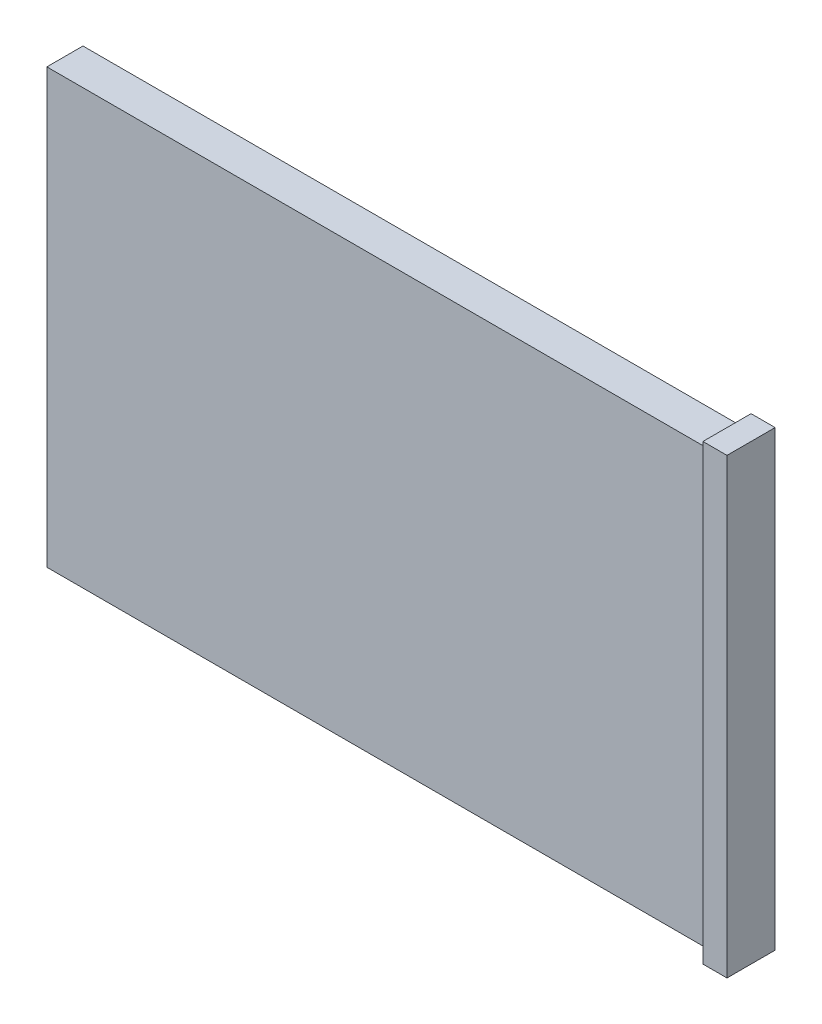
ISO-10303-21;
HEADER;
FILE_DESCRIPTION(('STEP AP214'),'2;1');
FILE_NAME('part.step','',(''),(''),'','','');
FILE_SCHEMA(('AUTOMOTIVE_DESIGN { 1 0 10303 214 1 1 1 1 }'));
ENDSEC;
DATA;
#1=APPLICATION_CONTEXT('core data for automotive mechanical design processes');
#2=APPLICATION_PROTOCOL_DEFINITION('international standard','automotive_design',2000,#1);
#3=PRODUCT_CONTEXT('',#1,'mechanical');
#4=PRODUCT('Part','Part','',(#3));
#5=PRODUCT_RELATED_PRODUCT_CATEGORY('part','',(#4));
#6=PRODUCT_DEFINITION_FORMATION('','',#4);
#7=PRODUCT_DEFINITION_CONTEXT('part definition',#1,'design');
#8=PRODUCT_DEFINITION('design','',#6,#7);
#9=PRODUCT_DEFINITION_SHAPE('','',#8);
#10=(LENGTH_UNIT() NAMED_UNIT(*) SI_UNIT(.MILLI.,.METRE.));
#11=(NAMED_UNIT(*) PLANE_ANGLE_UNIT() SI_UNIT($,.RADIAN.));
#12=(NAMED_UNIT(*) SI_UNIT($,.STERADIAN.) SOLID_ANGLE_UNIT());
#13=UNCERTAINTY_MEASURE_WITH_UNIT(LENGTH_MEASURE(1.E-05),#10,'distance_accuracy_value','');
#14=(GEOMETRIC_REPRESENTATION_CONTEXT(3) GLOBAL_UNCERTAINTY_ASSIGNED_CONTEXT((#13)) GLOBAL_UNIT_ASSIGNED_CONTEXT((#10,
#11,#12)) REPRESENTATION_CONTEXT('',''));
#15=CARTESIAN_POINT('',(0.,0.,0.));
#16=DIRECTION('',(0.,0.,1.));
#17=DIRECTION('',(1.,0.,0.));
#18=AXIS2_PLACEMENT_3D('',#15,#16,#17);
#19=CARTESIAN_POINT('',(-13.75,-9.,1.5));
#20=DIRECTION('',(1.,0.,0.));
#21=DIRECTION('',(0.,0.,-1.));
#22=AXIS2_PLACEMENT_3D('',#19,#20,#21);
#23=PLANE('',#22);
#24=DIRECTION('',(0.,-1.,0.));
#25=VECTOR('',#24,1.);
#26=CARTESIAN_POINT('',(-13.75,-9.,0.));
#27=LINE('',#26,#25);
#28=CARTESIAN_POINT('',(-13.75,9.,0.));
#29=VERTEX_POINT('',#28);
#30=CARTESIAN_POINT('',(-13.75,-9.,0.));
#31=VERTEX_POINT('',#30);
#32=EDGE_CURVE('E134',#29,#31,#27,.T.);
#33=ORIENTED_EDGE('',*,*,#32,.T.);
#34=DIRECTION('',(0.,0.,-1.));
#35=VECTOR('',#34,1.);
#36=CARTESIAN_POINT('',(-13.75,-9.,1.5));
#37=LINE('',#36,#35);
#38=CARTESIAN_POINT('',(-13.75,-9.,1.5));
#39=VERTEX_POINT('',#38);
#40=EDGE_CURVE('E11',#39,#31,#37,.T.);
#41=ORIENTED_EDGE('',*,*,#40,.F.);
#42=DIRECTION('',(0.,-1.,0.));
#43=VECTOR('',#42,1.);
#44=CARTESIAN_POINT('',(-13.75,-9.,1.5));
#45=LINE('',#44,#43);
#46=CARTESIAN_POINT('',(-13.75,9.,1.5));
#47=VERTEX_POINT('',#46);
#48=EDGE_CURVE('E143',#47,#39,#45,.T.);
#49=ORIENTED_EDGE('',*,*,#48,.F.);
#50=DIRECTION('',(0.,0.,-1.));
#51=VECTOR('',#50,1.);
#52=CARTESIAN_POINT('',(-13.75,9.,1.5));
#53=LINE('',#52,#51);
#54=EDGE_CURVE('E148',#47,#29,#53,.T.);
#55=ORIENTED_EDGE('',*,*,#54,.T.);
#56=EDGE_LOOP('',(#33,#41,#49,#55));
#57=FACE_BOUND('',#56,.T.);
#58=ADVANCED_FACE('F39',(#57),#23,.F.);
#59=CARTESIAN_POINT('',(13.75,-9.,1.5));
#60=DIRECTION('',(0.,1.,0.));
#61=DIRECTION('',(-1.,0.,0.));
#62=AXIS2_PLACEMENT_3D('',#59,#60,#61);
#63=PLANE('',#62);
#64=DIRECTION('',(1.,0.,0.));
#65=VECTOR('',#64,1.);
#66=CARTESIAN_POINT('',(13.75,-9.,0.));
#67=LINE('',#66,#65);
#68=CARTESIAN_POINT('',(13.75,-9.,0.));
#69=VERTEX_POINT('',#68);
#70=EDGE_CURVE('E137',#31,#69,#67,.T.);
#71=ORIENTED_EDGE('',*,*,#70,.T.);
#72=DIRECTION('',(0.,0.,-1.));
#73=VECTOR('',#72,1.);
#74=CARTESIAN_POINT('',(13.75,-9.,1.5));
#75=LINE('',#74,#73);
#76=CARTESIAN_POINT('',(13.75,-9.,1.5));
#77=VERTEX_POINT('',#76);
#78=EDGE_CURVE('E47',#77,#69,#75,.T.);
#79=ORIENTED_EDGE('',*,*,#78,.F.);
#80=DIRECTION('',(1.,0.,0.));
#81=VECTOR('',#80,1.);
#82=CARTESIAN_POINT('',(13.75,-9.,1.5));
#83=LINE('',#82,#81);
#84=EDGE_CURVE('E79',#39,#77,#83,.T.);
#85=ORIENTED_EDGE('',*,*,#84,.F.);
#86=ORIENTED_EDGE('',*,*,#40,.T.);
#87=EDGE_LOOP('',(#71,#79,#85,#86));
#88=FACE_BOUND('',#87,.T.);
#89=ADVANCED_FACE('F161',(#88),#63,.F.);
#90=CARTESIAN_POINT('',(13.75,9.,1.5));
#91=DIRECTION('',(0.,-1.,0.));
#92=DIRECTION('',(1.,0.,0.));
#93=AXIS2_PLACEMENT_3D('',#90,#91,#92);
#94=PLANE('',#93);
#95=DIRECTION('',(-1.,0.,0.));
#96=VECTOR('',#95,1.);
#97=CARTESIAN_POINT('',(13.75,9.,0.));
#98=LINE('',#97,#96);
#99=CARTESIAN_POINT('',(13.75,9.,0.));
#100=VERTEX_POINT('',#99);
#101=EDGE_CURVE('E72',#100,#29,#98,.T.);
#102=ORIENTED_EDGE('',*,*,#101,.T.);
#103=ORIENTED_EDGE('',*,*,#54,.F.);
#104=DIRECTION('',(-1.,0.,0.));
#105=VECTOR('',#104,1.);
#106=CARTESIAN_POINT('',(13.75,9.,1.5));
#107=LINE('',#106,#105);
#108=CARTESIAN_POINT('',(13.75,9.,1.5));
#109=VERTEX_POINT('',#108);
#110=EDGE_CURVE('E55',#109,#47,#107,.T.);
#111=ORIENTED_EDGE('',*,*,#110,.F.);
#112=DIRECTION('',(0.,0.,-1.));
#113=VECTOR('',#112,1.);
#114=CARTESIAN_POINT('',(13.75,9.,1.5));
#115=LINE('',#114,#113);
#116=EDGE_CURVE('E69',#109,#100,#115,.T.);
#117=ORIENTED_EDGE('',*,*,#116,.T.);
#118=EDGE_LOOP('',(#102,#103,#111,#117));
#119=FACE_BOUND('',#118,.T.);
#120=ADVANCED_FACE('F168',(#119),#94,.F.);
#121=CARTESIAN_POINT('',(0.,0.,1.5));
#122=DIRECTION('',(0.,0.,1.));
#123=DIRECTION('',(1.,0.,0.));
#124=AXIS2_PLACEMENT_3D('',#121,#122,#123);
#125=PLANE('',#124);
#126=ORIENTED_EDGE('',*,*,#48,.T.);
#127=ORIENTED_EDGE('',*,*,#84,.T.);
#128=DIRECTION('',(0.,1.,0.));
#129=VECTOR('',#128,1.);
#130=CARTESIAN_POINT('',(13.75,-9.,1.5));
#131=LINE('',#130,#129);
#132=EDGE_CURVE('E146',#77,#109,#131,.T.);
#133=ORIENTED_EDGE('',*,*,#132,.T.);
#134=ORIENTED_EDGE('',*,*,#110,.T.);
#135=EDGE_LOOP('',(#126,#127,#133,#134));
#136=FACE_BOUND('',#135,.T.);
#137=ADVANCED_FACE('F170',(#136),#125,.T.);
#138=CARTESIAN_POINT('',(0.,0.,0.));
#139=DIRECTION('',(0.,0.,1.));
#140=DIRECTION('',(1.,0.,0.));
#141=AXIS2_PLACEMENT_3D('',#138,#139,#140);
#142=PLANE('',#141);
#143=ORIENTED_EDGE('',*,*,#32,.F.);
#144=ORIENTED_EDGE('',*,*,#101,.F.);
#145=DIRECTION('',(0.,1.,0.));
#146=VECTOR('',#145,1.);
#147=CARTESIAN_POINT('',(13.75,-9.,0.));
#148=LINE('',#147,#146);
#149=EDGE_CURVE('E152',#69,#100,#148,.T.);
#150=ORIENTED_EDGE('',*,*,#149,.F.);
#151=ORIENTED_EDGE('',*,*,#70,.F.);
#152=EDGE_LOOP('',(#143,#144,#150,#151));
#153=FACE_BOUND('',#152,.T.);
#154=ADVANCED_FACE('F165',(#153),#142,.F.);
#155=CARTESIAN_POINT('',(13.75,0.,0.));
#156=DIRECTION('',(1.,0.,0.));
#157=DIRECTION('',(0.,0.,-1.));
#158=AXIS2_PLACEMENT_3D('',#155,#156,#157);
#159=PLANE('',#158);
#160=DIRECTION('',(0.,-1.,0.));
#161=VECTOR('',#160,1.);
#162=CARTESIAN_POINT('',(13.75,-9.4,1.75));
#163=LINE('',#162,#161);
#164=CARTESIAN_POINT('',(13.75,9.4,1.75));
#165=VERTEX_POINT('',#164);
#166=CARTESIAN_POINT('',(13.75,-9.4,1.75));
#167=VERTEX_POINT('',#166);
#168=EDGE_CURVE('E133',#165,#167,#163,.T.);
#169=ORIENTED_EDGE('',*,*,#168,.F.);
#170=DIRECTION('',(0.,0.,1.));
#171=VECTOR('',#170,1.);
#172=CARTESIAN_POINT('',(13.75,9.4,-0.249999999999997));
#173=LINE('',#172,#171);
#174=CARTESIAN_POINT('',(13.75,9.4,-0.249999999999997));
#175=VERTEX_POINT('',#174);
#176=EDGE_CURVE('E129',#175,#165,#173,.T.);
#177=ORIENTED_EDGE('',*,*,#176,.F.);
#178=DIRECTION('',(0.,1.,0.));
#179=VECTOR('',#178,1.);
#180=CARTESIAN_POINT('',(13.75,-9.4,-0.249999999999997));
#181=LINE('',#180,#179);
#182=CARTESIAN_POINT('',(13.75,-9.4,-0.249999999999997));
#183=VERTEX_POINT('',#182);
#184=EDGE_CURVE('E265',#183,#175,#181,.T.);
#185=ORIENTED_EDGE('',*,*,#184,.F.);
#186=DIRECTION('',(0.,0.,-1.));
#187=VECTOR('',#186,1.);
#188=CARTESIAN_POINT('',(13.75,-9.4,-0.249999999999997));
#189=LINE('',#188,#187);
#190=EDGE_CURVE('E268',#167,#183,#189,.T.);
#191=ORIENTED_EDGE('',*,*,#190,.F.);
#192=EDGE_LOOP('',(#169,#177,#185,#191));
#193=FACE_BOUND('',#192,.T.);
#194=ORIENTED_EDGE('',*,*,#78,.T.);
#195=ORIENTED_EDGE('',*,*,#149,.T.);
#196=ORIENTED_EDGE('',*,*,#116,.F.);
#197=ORIENTED_EDGE('',*,*,#132,.F.);
#198=EDGE_LOOP('',(#194,#195,#196,#197));
#199=FACE_BOUND('',#198,.T.);
#200=ADVANCED_FACE('F160',(#193,#199),#159,.F.);
#201=CARTESIAN_POINT('',(14.75,-9.4,1.75));
#202=DIRECTION('',(0.,0.,-1.));
#203=DIRECTION('',(-1.,0.,0.));
#204=AXIS2_PLACEMENT_3D('',#201,#202,#203);
#205=PLANE('',#204);
#206=ORIENTED_EDGE('',*,*,#168,.T.);
#207=DIRECTION('',(-1.,0.,0.));
#208=VECTOR('',#207,1.);
#209=CARTESIAN_POINT('',(14.75,-9.4,1.75));
#210=LINE('',#209,#208);
#211=CARTESIAN_POINT('',(14.75,-9.4,1.75));
#212=VERTEX_POINT('',#211);
#213=EDGE_CURVE('E113',#212,#167,#210,.T.);
#214=ORIENTED_EDGE('',*,*,#213,.F.);
#215=DIRECTION('',(0.,-1.,0.));
#216=VECTOR('',#215,1.);
#217=CARTESIAN_POINT('',(14.75,-9.4,1.75));
#218=LINE('',#217,#216);
#219=CARTESIAN_POINT('',(14.75,9.4,1.75));
#220=VERTEX_POINT('',#219);
#221=EDGE_CURVE('E120',#220,#212,#218,.T.);
#222=ORIENTED_EDGE('',*,*,#221,.F.);
#223=DIRECTION('',(-1.,0.,0.));
#224=VECTOR('',#223,1.);
#225=CARTESIAN_POINT('',(14.75,9.4,1.75));
#226=LINE('',#225,#224);
#227=EDGE_CURVE('E262',#220,#165,#226,.T.);
#228=ORIENTED_EDGE('',*,*,#227,.T.);
#229=EDGE_LOOP('',(#206,#214,#222,#228));
#230=FACE_BOUND('',#229,.T.);
#231=ADVANCED_FACE('F131',(#230),#205,.F.);
#232=CARTESIAN_POINT('',(14.75,-9.4,-0.249999999999997));
#233=DIRECTION('',(0.,1.,0.));
#234=DIRECTION('',(0.,0.,1.));
#235=AXIS2_PLACEMENT_3D('',#232,#233,#234);
#236=PLANE('',#235);
#237=ORIENTED_EDGE('',*,*,#190,.T.);
#238=DIRECTION('',(-1.,0.,0.));
#239=VECTOR('',#238,1.);
#240=CARTESIAN_POINT('',(14.75,-9.4,-0.249999999999997));
#241=LINE('',#240,#239);
#242=CARTESIAN_POINT('',(14.75,-9.4,-0.249999999999997));
#243=VERTEX_POINT('',#242);
#244=EDGE_CURVE('E116',#243,#183,#241,.T.);
#245=ORIENTED_EDGE('',*,*,#244,.F.);
#246=DIRECTION('',(0.,0.,-1.));
#247=VECTOR('',#246,1.);
#248=CARTESIAN_POINT('',(14.75,-9.4,-0.249999999999997));
#249=LINE('',#248,#247);
#250=EDGE_CURVE('E109',#212,#243,#249,.T.);
#251=ORIENTED_EDGE('',*,*,#250,.F.);
#252=ORIENTED_EDGE('',*,*,#213,.T.);
#253=EDGE_LOOP('',(#237,#245,#251,#252));
#254=FACE_BOUND('',#253,.T.);
#255=ADVANCED_FACE('F111',(#254),#236,.F.);
#256=CARTESIAN_POINT('',(14.75,-9.4,-0.249999999999997));
#257=DIRECTION('',(0.,0.,1.));
#258=DIRECTION('',(1.,0.,0.));
#259=AXIS2_PLACEMENT_3D('',#256,#257,#258);
#260=PLANE('',#259);
#261=ORIENTED_EDGE('',*,*,#184,.T.);
#262=DIRECTION('',(-1.,0.,0.));
#263=VECTOR('',#262,1.);
#264=CARTESIAN_POINT('',(14.75,9.4,-0.249999999999997));
#265=LINE('',#264,#263);
#266=CARTESIAN_POINT('',(14.75,9.4,-0.249999999999997));
#267=VERTEX_POINT('',#266);
#268=EDGE_CURVE('E139',#267,#175,#265,.T.);
#269=ORIENTED_EDGE('',*,*,#268,.F.);
#270=DIRECTION('',(0.,1.,0.));
#271=VECTOR('',#270,1.);
#272=CARTESIAN_POINT('',(14.75,-9.4,-0.249999999999997));
#273=LINE('',#272,#271);
#274=EDGE_CURVE('E119',#243,#267,#273,.T.);
#275=ORIENTED_EDGE('',*,*,#274,.F.);
#276=ORIENTED_EDGE('',*,*,#244,.T.);
#277=EDGE_LOOP('',(#261,#269,#275,#276));
#278=FACE_BOUND('',#277,.T.);
#279=ADVANCED_FACE('F230',(#278),#260,.F.);
#280=CARTESIAN_POINT('',(14.75,9.4,-0.249999999999997));
#281=DIRECTION('',(0.,-1.,0.));
#282=DIRECTION('',(0.,0.,-1.));
#283=AXIS2_PLACEMENT_3D('',#280,#281,#282);
#284=PLANE('',#283);
#285=ORIENTED_EDGE('',*,*,#176,.T.);
#286=ORIENTED_EDGE('',*,*,#227,.F.);
#287=DIRECTION('',(0.,0.,1.));
#288=VECTOR('',#287,1.);
#289=CARTESIAN_POINT('',(14.75,9.4,-0.249999999999997));
#290=LINE('',#289,#288);
#291=EDGE_CURVE('E125',#267,#220,#290,.T.);
#292=ORIENTED_EDGE('',*,*,#291,.F.);
#293=ORIENTED_EDGE('',*,*,#268,.T.);
#294=EDGE_LOOP('',(#285,#286,#292,#293));
#295=FACE_BOUND('',#294,.T.);
#296=ADVANCED_FACE('F239',(#295),#284,.F.);
#297=CARTESIAN_POINT('',(14.75,0.,0.));
#298=DIRECTION('',(1.,0.,0.));
#299=DIRECTION('',(0.,0.,-1.));
#300=AXIS2_PLACEMENT_3D('',#297,#298,#299);
#301=PLANE('',#300);
#302=ORIENTED_EDGE('',*,*,#221,.T.);
#303=ORIENTED_EDGE('',*,*,#250,.T.);
#304=ORIENTED_EDGE('',*,*,#274,.T.);
#305=ORIENTED_EDGE('',*,*,#291,.T.);
#306=EDGE_LOOP('',(#302,#303,#304,#305));
#307=FACE_BOUND('',#306,.T.);
#308=ADVANCED_FACE('F123',(#307),#301,.T.);
#309=CLOSED_SHELL('',(#58,#89,#120,#137,#154,#200,#231,#255,#279,#296,#308));
#310=MANIFOLD_SOLID_BREP('B2',#309);
#311=ADVANCED_BREP_SHAPE_REPRESENTATION('',(#18,#310),#14);
#312=SHAPE_DEFINITION_REPRESENTATION(#9,#311);
ENDSEC;
END-ISO-10303-21;
